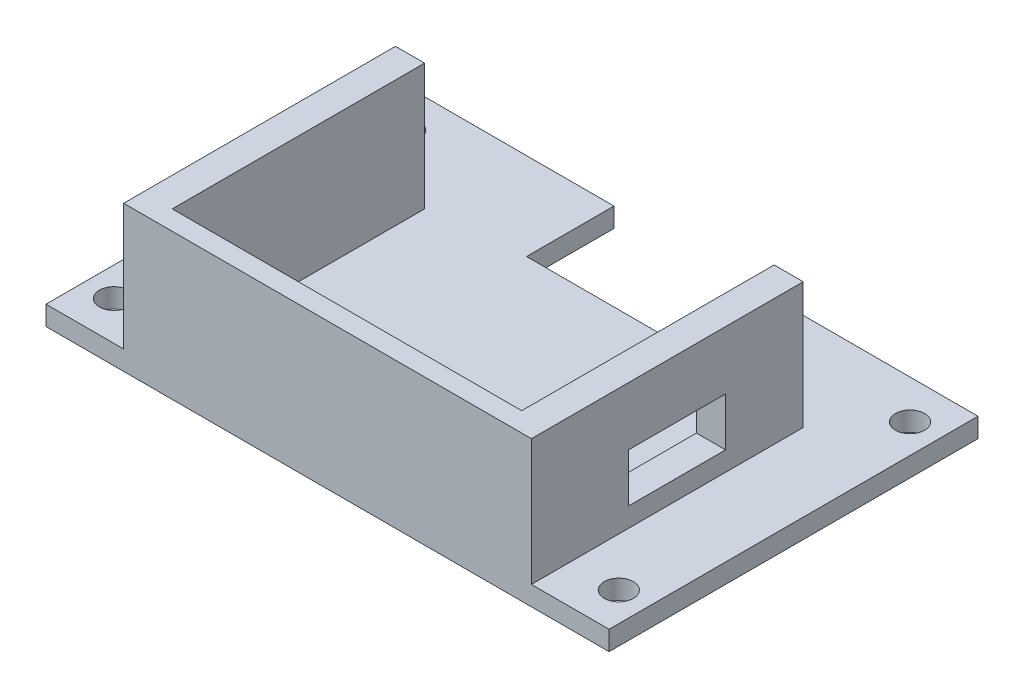
ISO-10303-21;
HEADER;
FILE_DESCRIPTION(('STEP AP214'),'2;1');
FILE_NAME('part.step','',(''),(''),'','','');
FILE_SCHEMA(('AUTOMOTIVE_DESIGN { 1 0 10303 214 1 1 1 1 }'));
ENDSEC;
DATA;
#1=APPLICATION_CONTEXT('core data for automotive mechanical design processes');
#2=APPLICATION_PROTOCOL_DEFINITION('international standard','automotive_design',2000,#1);
#3=PRODUCT_CONTEXT('',#1,'mechanical');
#4=PRODUCT('Part','Part','',(#3));
#5=PRODUCT_RELATED_PRODUCT_CATEGORY('part','',(#4));
#6=PRODUCT_DEFINITION_FORMATION('','',#4);
#7=PRODUCT_DEFINITION_CONTEXT('part definition',#1,'design');
#8=PRODUCT_DEFINITION('design','',#6,#7);
#9=PRODUCT_DEFINITION_SHAPE('','',#8);
#10=(LENGTH_UNIT() NAMED_UNIT(*) SI_UNIT(.MILLI.,.METRE.));
#11=(NAMED_UNIT(*) PLANE_ANGLE_UNIT() SI_UNIT($,.RADIAN.));
#12=(NAMED_UNIT(*) SI_UNIT($,.STERADIAN.) SOLID_ANGLE_UNIT());
#13=UNCERTAINTY_MEASURE_WITH_UNIT(LENGTH_MEASURE(1.E-05),#10,'distance_accuracy_value','');
#14=(GEOMETRIC_REPRESENTATION_CONTEXT(3) GLOBAL_UNCERTAINTY_ASSIGNED_CONTEXT((#13)) GLOBAL_UNIT_ASSIGNED_CONTEXT((#10,
#11,#12)) REPRESENTATION_CONTEXT('',''));
#15=CARTESIAN_POINT('',(0.,0.,0.));
#16=DIRECTION('',(0.,0.,1.));
#17=DIRECTION('',(1.,0.,0.));
#18=AXIS2_PLACEMENT_3D('',#15,#16,#17);
#19=CARTESIAN_POINT('',(0.,1.,0.));
#20=DIRECTION('',(0.,-1.,0.));
#21=DIRECTION('',(0.,0.,-1.));
#22=AXIS2_PLACEMENT_3D('',#19,#20,#21);
#23=PLANE('',#22);
#24=CARTESIAN_POINT('',(26.,1.,-15.));
#25=DIRECTION('',(0.,1.,0.));
#26=DIRECTION('',(0.,0.,-1.));
#27=AXIS2_PLACEMENT_3D('',#24,#25,#26);
#28=CIRCLE('',#27,1.5);
#29=CARTESIAN_POINT('',(26.,1.,-16.5));
#30=VERTEX_POINT('',#29);
#31=EDGE_CURVE('E696',#30,#30,#28,.T.);
#32=ORIENTED_EDGE('',*,*,#31,.F.);
#33=EDGE_LOOP('',(#32));
#34=FACE_BOUND('',#33,.T.);
#35=CARTESIAN_POINT('',(26.,1.,15.));
#36=DIRECTION('',(0.,1.,0.));
#37=DIRECTION('',(0.,0.,1.));
#38=AXIS2_PLACEMENT_3D('',#35,#36,#37);
#39=CIRCLE('',#38,1.5);
#40=CARTESIAN_POINT('',(26.,1.,16.5));
#41=VERTEX_POINT('',#40);
#42=EDGE_CURVE('E703',#41,#41,#39,.T.);
#43=ORIENTED_EDGE('',*,*,#42,.F.);
#44=EDGE_LOOP('',(#43));
#45=FACE_BOUND('',#44,.T.);
#46=CARTESIAN_POINT('',(-26.,1.,15.));
#47=DIRECTION('',(0.,1.,0.));
#48=DIRECTION('',(0.,0.,-1.));
#49=AXIS2_PLACEMENT_3D('',#46,#47,#48);
#50=CIRCLE('',#49,1.5);
#51=CARTESIAN_POINT('',(-26.,1.,13.5));
#52=VERTEX_POINT('',#51);
#53=EDGE_CURVE('E715',#52,#52,#50,.T.);
#54=ORIENTED_EDGE('',*,*,#53,.F.);
#55=EDGE_LOOP('',(#54));
#56=FACE_BOUND('',#55,.T.);
#57=CARTESIAN_POINT('',(-26.,1.,-15.));
#58=DIRECTION('',(0.,1.,0.));
#59=DIRECTION('',(0.,0.,1.));
#60=AXIS2_PLACEMENT_3D('',#57,#58,#59);
#61=CIRCLE('',#60,1.5);
#62=CARTESIAN_POINT('',(-26.,1.,-13.5));
#63=VERTEX_POINT('',#62);
#64=EDGE_CURVE('E708',#63,#63,#61,.T.);
#65=ORIENTED_EDGE('',*,*,#64,.F.);
#66=EDGE_LOOP('',(#65));
#67=FACE_BOUND('',#66,.T.);
#68=DIRECTION('',(1.,0.,0.));
#69=VECTOR('',#68,1.);
#70=CARTESIAN_POINT('',(-29.,1.,19.));
#71=LINE('',#70,#69);
#72=CARTESIAN_POINT('',(-29.,1.,19.));
#73=VERTEX_POINT('',#72);
#74=CARTESIAN_POINT('',(-21.,1.,19.));
#75=VERTEX_POINT('',#74);
#76=EDGE_CURVE('E354',#73,#75,#71,.T.);
#77=ORIENTED_EDGE('',*,*,#76,.T.);
#78=DIRECTION('',(0.,0.,1.));
#79=VECTOR('',#78,1.);
#80=CARTESIAN_POINT('',(-21.,1.,-8.99999999999999));
#81=LINE('',#80,#79);
#82=CARTESIAN_POINT('',(-21.,1.,-8.99999999999999));
#83=VERTEX_POINT('',#82);
#84=EDGE_CURVE('E255',#83,#75,#81,.T.);
#85=ORIENTED_EDGE('',*,*,#84,.F.);
#86=DIRECTION('',(-1.,0.,0.));
#87=VECTOR('',#86,1.);
#88=CARTESIAN_POINT('',(-18.,1.,-8.99999999999998));
#89=LINE('',#88,#87);
#90=CARTESIAN_POINT('',(-18.,1.,-8.99999999999998));
#91=VERTEX_POINT('',#90);
#92=EDGE_CURVE('E264',#91,#83,#89,.T.);
#93=ORIENTED_EDGE('',*,*,#92,.F.);
#94=DIRECTION('',(0.,0.,-1.));
#95=VECTOR('',#94,1.);
#96=CARTESIAN_POINT('',(-18.,1.,-8.99999999999998));
#97=LINE('',#96,#95);
#98=CARTESIAN_POINT('',(-18.,1.,17.));
#99=VERTEX_POINT('',#98);
#100=EDGE_CURVE('E250',#99,#91,#97,.T.);
#101=ORIENTED_EDGE('',*,*,#100,.F.);
#102=DIRECTION('',(-1.,0.,0.));
#103=VECTOR('',#102,1.);
#104=CARTESIAN_POINT('',(-21.,1.,17.));
#105=LINE('',#104,#103);
#106=CARTESIAN_POINT('',(18.,1.,17.));
#107=VERTEX_POINT('',#106);
#108=EDGE_CURVE('E225',#107,#99,#105,.T.);
#109=ORIENTED_EDGE('',*,*,#108,.F.);
#110=DIRECTION('',(0.,0.,1.));
#111=VECTOR('',#110,1.);
#112=CARTESIAN_POINT('',(18.,1.,-8.99999999999999));
#113=LINE('',#112,#111);
#114=CARTESIAN_POINT('',(18.,1.,-8.99999999999999));
#115=VERTEX_POINT('',#114);
#116=EDGE_CURVE('E277',#115,#107,#113,.T.);
#117=ORIENTED_EDGE('',*,*,#116,.F.);
#118=DIRECTION('',(-1.,0.,0.));
#119=VECTOR('',#118,1.);
#120=CARTESIAN_POINT('',(18.,1.,-8.99999999999999));
#121=LINE('',#120,#119);
#122=CARTESIAN_POINT('',(21.,1.,-8.99999999999999));
#123=VERTEX_POINT('',#122);
#124=EDGE_CURVE('E283',#123,#115,#121,.T.);
#125=ORIENTED_EDGE('',*,*,#124,.F.);
#126=DIRECTION('',(0.,0.,-1.));
#127=VECTOR('',#126,1.);
#128=CARTESIAN_POINT('',(21.,1.,-8.99999999999999));
#129=LINE('',#128,#127);
#130=CARTESIAN_POINT('',(21.,1.,19.));
#131=VERTEX_POINT('',#130);
#132=EDGE_CURVE('E293',#131,#123,#129,.T.);
#133=ORIENTED_EDGE('',*,*,#132,.F.);
#134=CARTESIAN_POINT('',(29.,1.,19.));
#135=VERTEX_POINT('',#134);
#136=EDGE_CURVE('E353',#131,#135,#71,.T.);
#137=ORIENTED_EDGE('',*,*,#136,.T.);
#138=DIRECTION('',(0.,0.,-1.));
#139=VECTOR('',#138,1.);
#140=CARTESIAN_POINT('',(29.,1.,19.));
#141=LINE('',#140,#139);
#142=CARTESIAN_POINT('',(29.,1.,-19.));
#143=VERTEX_POINT('',#142);
#144=EDGE_CURVE('E340',#135,#143,#141,.T.);
#145=ORIENTED_EDGE('',*,*,#144,.T.);
#146=DIRECTION('',(-1.,0.,0.));
#147=VECTOR('',#146,1.);
#148=CARTESIAN_POINT('',(-29.,1.,-19.));
#149=LINE('',#148,#147);
#150=CARTESIAN_POINT('',(8.5,1.,-19.));
#151=VERTEX_POINT('',#150);
#152=EDGE_CURVE('E346',#143,#151,#149,.T.);
#153=ORIENTED_EDGE('',*,*,#152,.T.);
#154=DIRECTION('',(0.,0.,-1.));
#155=VECTOR('',#154,1.);
#156=CARTESIAN_POINT('',(8.5,1.,-9.99999999999999));
#157=LINE('',#156,#155);
#158=CARTESIAN_POINT('',(8.5,1.,-9.99999999999999));
#159=VERTEX_POINT('',#158);
#160=EDGE_CURVE('E306',#159,#151,#157,.T.);
#161=ORIENTED_EDGE('',*,*,#160,.F.);
#162=DIRECTION('',(1.,0.,0.));
#163=VECTOR('',#162,1.);
#164=CARTESIAN_POINT('',(-8.5,1.,-9.99999999999999));
#165=LINE('',#164,#163);
#166=CARTESIAN_POINT('',(-8.5,1.,-9.99999999999999));
#167=VERTEX_POINT('',#166);
#168=EDGE_CURVE('E312',#167,#159,#165,.T.);
#169=ORIENTED_EDGE('',*,*,#168,.F.);
#170=DIRECTION('',(0.,0.,1.));
#171=VECTOR('',#170,1.);
#172=CARTESIAN_POINT('',(-8.5,1.,-9.99999999999999));
#173=LINE('',#172,#171);
#174=CARTESIAN_POINT('',(-8.5,1.,-19.));
#175=VERTEX_POINT('',#174);
#176=EDGE_CURVE('E309',#175,#167,#173,.T.);
#177=ORIENTED_EDGE('',*,*,#176,.F.);
#178=CARTESIAN_POINT('',(-29.,1.,-19.));
#179=VERTEX_POINT('',#178);
#180=EDGE_CURVE('E344',#175,#179,#149,.T.);
#181=ORIENTED_EDGE('',*,*,#180,.T.);
#182=DIRECTION('',(0.,0.,1.));
#183=VECTOR('',#182,1.);
#184=CARTESIAN_POINT('',(-29.,1.,19.));
#185=LINE('',#184,#183);
#186=EDGE_CURVE('E350',#179,#73,#185,.T.);
#187=ORIENTED_EDGE('',*,*,#186,.T.);
#188=EDGE_LOOP('',(#77,#85,#93,#101,#109,#117,#125,#133,#137,#145,#153,#161,#169,#177,#181,#187));
#189=FACE_BOUND('',#188,.T.);
#190=ADVANCED_FACE('F41',(#34,#45,#56,#67,#189),#23,.F.);
#191=CARTESIAN_POINT('',(18.,14.,-8.99999999999999));
#192=DIRECTION('',(1.,0.,0.));
#193=DIRECTION('',(0.,0.,-1.));
#194=AXIS2_PLACEMENT_3D('',#191,#192,#193);
#195=PLANE('',#194);
#196=DIRECTION('',(0.,1.,0.));
#197=VECTOR('',#196,1.);
#198=CARTESIAN_POINT('',(18.,14.,9.00000000000001));
#199=LINE('',#198,#197);
#200=CARTESIAN_POINT('',(18.,3.,9.00000000000001));
#201=VERTEX_POINT('',#200);
#202=CARTESIAN_POINT('',(18.,8.,9.00000000000001));
#203=VERTEX_POINT('',#202);
#204=EDGE_CURVE('E193',#201,#203,#199,.T.);
#205=ORIENTED_EDGE('',*,*,#204,.F.);
#206=DIRECTION('',(0.,0.,1.));
#207=VECTOR('',#206,1.);
#208=CARTESIAN_POINT('',(18.,3.,-8.99999999999998));
#209=LINE('',#208,#207);
#210=CARTESIAN_POINT('',(18.,3.,-0.999999999999994));
#211=VERTEX_POINT('',#210);
#212=EDGE_CURVE('E57',#211,#201,#209,.T.);
#213=ORIENTED_EDGE('',*,*,#212,.F.);
#214=DIRECTION('',(0.,-1.,0.));
#215=VECTOR('',#214,1.);
#216=CARTESIAN_POINT('',(18.,14.,-0.999999999999994));
#217=LINE('',#216,#215);
#218=CARTESIAN_POINT('',(18.,8.,-0.999999999999994));
#219=VERTEX_POINT('',#218);
#220=EDGE_CURVE('E206',#219,#211,#217,.T.);
#221=ORIENTED_EDGE('',*,*,#220,.F.);
#222=DIRECTION('',(0.,0.,-1.));
#223=VECTOR('',#222,1.);
#224=CARTESIAN_POINT('',(18.,8.,-8.99999999999998));
#225=LINE('',#224,#223);
#226=EDGE_CURVE('E201',#203,#219,#225,.T.);
#227=ORIENTED_EDGE('',*,*,#226,.F.);
#228=EDGE_LOOP('',(#205,#213,#221,#227));
#229=FACE_BOUND('',#228,.T.);
#230=DIRECTION('',(0.,-1.,0.));
#231=VECTOR('',#230,1.);
#232=CARTESIAN_POINT('',(18.,14.,17.));
#233=LINE('',#232,#231);
#234=CARTESIAN_POINT('',(18.,14.,17.));
#235=VERTEX_POINT('',#234);
#236=EDGE_CURVE('E247',#235,#107,#233,.T.);
#237=ORIENTED_EDGE('',*,*,#236,.F.);
#238=DIRECTION('',(0.,0.,1.));
#239=VECTOR('',#238,1.);
#240=CARTESIAN_POINT('',(18.,14.,-8.99999999999999));
#241=LINE('',#240,#239);
#242=CARTESIAN_POINT('',(18.,14.,-8.99999999999999));
#243=VERTEX_POINT('',#242);
#244=EDGE_CURVE('E278',#243,#235,#241,.T.);
#245=ORIENTED_EDGE('',*,*,#244,.F.);
#246=DIRECTION('',(0.,-1.,0.));
#247=VECTOR('',#246,1.);
#248=CARTESIAN_POINT('',(18.,14.,-8.99999999999999));
#249=LINE('',#248,#247);
#250=EDGE_CURVE('E289',#243,#115,#249,.T.);
#251=ORIENTED_EDGE('',*,*,#250,.T.);
#252=ORIENTED_EDGE('',*,*,#116,.T.);
#253=EDGE_LOOP('',(#237,#245,#251,#252));
#254=FACE_BOUND('',#253,.T.);
#255=ADVANCED_FACE('F430',(#229,#254),#195,.F.);
#256=CARTESIAN_POINT('',(-18.,14.,-8.99999999999998));
#257=DIRECTION('',(-1.,0.,0.));
#258=DIRECTION('',(0.,0.,1.));
#259=AXIS2_PLACEMENT_3D('',#256,#257,#258);
#260=PLANE('',#259);
#261=DIRECTION('',(0.,1.,0.));
#262=VECTOR('',#261,1.);
#263=CARTESIAN_POINT('',(-18.,14.,17.));
#264=LINE('',#263,#262);
#265=CARTESIAN_POINT('',(-18.,14.,17.));
#266=VERTEX_POINT('',#265);
#267=EDGE_CURVE('E244',#99,#266,#264,.T.);
#268=ORIENTED_EDGE('',*,*,#267,.F.);
#269=ORIENTED_EDGE('',*,*,#100,.T.);
#270=DIRECTION('',(0.,-1.,0.));
#271=VECTOR('',#270,1.);
#272=CARTESIAN_POINT('',(-18.,14.,-8.99999999999998));
#273=LINE('',#272,#271);
#274=CARTESIAN_POINT('',(-18.,14.,-8.99999999999998));
#275=VERTEX_POINT('',#274);
#276=EDGE_CURVE('E273',#275,#91,#273,.T.);
#277=ORIENTED_EDGE('',*,*,#276,.F.);
#278=DIRECTION('',(0.,0.,-1.));
#279=VECTOR('',#278,1.);
#280=CARTESIAN_POINT('',(-18.,14.,-8.99999999999998));
#281=LINE('',#280,#279);
#282=EDGE_CURVE('E251',#266,#275,#281,.T.);
#283=ORIENTED_EDGE('',*,*,#282,.F.);
#284=EDGE_LOOP('',(#268,#269,#277,#283));
#285=FACE_BOUND('',#284,.T.);
#286=ADVANCED_FACE('F428',(#285),#260,.F.);
#287=CARTESIAN_POINT('',(-29.,1.,-19.));
#288=DIRECTION('',(0.,0.,1.));
#289=DIRECTION('',(1.,0.,0.));
#290=AXIS2_PLACEMENT_3D('',#287,#288,#289);
#291=PLANE('',#290);
#292=DIRECTION('',(-1.,0.,0.));
#293=VECTOR('',#292,1.);
#294=CARTESIAN_POINT('',(-29.,-1.,-19.));
#295=LINE('',#294,#293);
#296=CARTESIAN_POINT('',(29.,-1.,-19.));
#297=VERTEX_POINT('',#296);
#298=CARTESIAN_POINT('',(8.5,-1.,-19.));
#299=VERTEX_POINT('',#298);
#300=EDGE_CURVE('E363',#297,#299,#295,.T.);
#301=ORIENTED_EDGE('',*,*,#300,.T.);
#302=DIRECTION('',(0.,1.,0.));
#303=VECTOR('',#302,1.);
#304=CARTESIAN_POINT('',(8.5,1.,-19.));
#305=LINE('',#304,#303);
#306=EDGE_CURVE('E335',#299,#151,#305,.T.);
#307=ORIENTED_EDGE('',*,*,#306,.T.);
#308=ORIENTED_EDGE('',*,*,#152,.F.);
#309=DIRECTION('',(0.,-1.,0.));
#310=VECTOR('',#309,1.);
#311=CARTESIAN_POINT('',(29.,1.,-19.));
#312=LINE('',#311,#310);
#313=EDGE_CURVE('E50',#143,#297,#312,.T.);
#314=ORIENTED_EDGE('',*,*,#313,.T.);
#315=EDGE_LOOP('',(#301,#307,#308,#314));
#316=FACE_BOUND('',#315,.T.);
#317=ADVANCED_FACE('F386',(#316),#291,.F.);
#318=CARTESIAN_POINT('',(29.,1.,19.));
#319=DIRECTION('',(-1.,0.,0.));
#320=DIRECTION('',(0.,0.,1.));
#321=AXIS2_PLACEMENT_3D('',#318,#319,#320);
#322=PLANE('',#321);
#323=DIRECTION('',(0.,0.,-1.));
#324=VECTOR('',#323,1.);
#325=CARTESIAN_POINT('',(29.,-1.,19.));
#326=LINE('',#325,#324);
#327=CARTESIAN_POINT('',(29.,-1.,19.));
#328=VERTEX_POINT('',#327);
#329=EDGE_CURVE('E339',#328,#297,#326,.T.);
#330=ORIENTED_EDGE('',*,*,#329,.T.);
#331=ORIENTED_EDGE('',*,*,#313,.F.);
#332=ORIENTED_EDGE('',*,*,#144,.F.);
#333=DIRECTION('',(0.,-1.,0.));
#334=VECTOR('',#333,1.);
#335=CARTESIAN_POINT('',(29.,1.,19.));
#336=LINE('',#335,#334);
#337=EDGE_CURVE('E358',#135,#328,#336,.T.);
#338=ORIENTED_EDGE('',*,*,#337,.T.);
#339=EDGE_LOOP('',(#330,#331,#332,#338));
#340=FACE_BOUND('',#339,.T.);
#341=ADVANCED_FACE('F43',(#340),#322,.F.);
#342=ORIENTED_EDGE('',*,*,#180,.F.);
#343=DIRECTION('',(0.,-1.,0.));
#344=VECTOR('',#343,1.);
#345=CARTESIAN_POINT('',(-8.5,1.,-19.));
#346=LINE('',#345,#344);
#347=CARTESIAN_POINT('',(-8.5,-1.,-19.));
#348=VERTEX_POINT('',#347);
#349=EDGE_CURVE('E328',#175,#348,#346,.T.);
#350=ORIENTED_EDGE('',*,*,#349,.T.);
#351=CARTESIAN_POINT('',(-29.,-1.,-19.));
#352=VERTEX_POINT('',#351);
#353=EDGE_CURVE('E362',#348,#352,#295,.T.);
#354=ORIENTED_EDGE('',*,*,#353,.T.);
#355=DIRECTION('',(0.,-1.,0.));
#356=VECTOR('',#355,1.);
#357=CARTESIAN_POINT('',(-29.,1.,-19.));
#358=LINE('',#357,#356);
#359=EDGE_CURVE('E379',#179,#352,#358,.T.);
#360=ORIENTED_EDGE('',*,*,#359,.F.);
#361=EDGE_LOOP('',(#342,#350,#354,#360));
#362=FACE_BOUND('',#361,.T.);
#363=ADVANCED_FACE('F420',(#362),#291,.F.);
#364=CARTESIAN_POINT('',(-29.,1.,19.));
#365=DIRECTION('',(1.,0.,0.));
#366=DIRECTION('',(0.,0.,-1.));
#367=AXIS2_PLACEMENT_3D('',#364,#365,#366);
#368=PLANE('',#367);
#369=DIRECTION('',(0.,0.,1.));
#370=VECTOR('',#369,1.);
#371=CARTESIAN_POINT('',(-29.,-1.,19.));
#372=LINE('',#371,#370);
#373=CARTESIAN_POINT('',(-29.,-1.,19.));
#374=VERTEX_POINT('',#373);
#375=EDGE_CURVE('E367',#352,#374,#372,.T.);
#376=ORIENTED_EDGE('',*,*,#375,.T.);
#377=DIRECTION('',(0.,-1.,0.));
#378=VECTOR('',#377,1.);
#379=CARTESIAN_POINT('',(-29.,1.,19.));
#380=LINE('',#379,#378);
#381=EDGE_CURVE('E375',#73,#374,#380,.T.);
#382=ORIENTED_EDGE('',*,*,#381,.F.);
#383=ORIENTED_EDGE('',*,*,#186,.F.);
#384=ORIENTED_EDGE('',*,*,#359,.T.);
#385=EDGE_LOOP('',(#376,#382,#383,#384));
#386=FACE_BOUND('',#385,.T.);
#387=ADVANCED_FACE('F412',(#386),#368,.F.);
#388=CARTESIAN_POINT('',(-29.,1.,19.));
#389=DIRECTION('',(0.,0.,-1.));
#390=DIRECTION('',(-1.,0.,0.));
#391=AXIS2_PLACEMENT_3D('',#388,#389,#390);
#392=PLANE('',#391);
#393=DIRECTION('',(1.,0.,0.));
#394=VECTOR('',#393,1.);
#395=CARTESIAN_POINT('',(-29.,-1.,19.));
#396=LINE('',#395,#394);
#397=EDGE_CURVE('E345',#374,#328,#396,.T.);
#398=ORIENTED_EDGE('',*,*,#397,.T.);
#399=ORIENTED_EDGE('',*,*,#337,.F.);
#400=ORIENTED_EDGE('',*,*,#136,.F.);
#401=DIRECTION('',(0.,-1.,0.));
#402=VECTOR('',#401,1.);
#403=CARTESIAN_POINT('',(21.,14.,19.));
#404=LINE('',#403,#402);
#405=CARTESIAN_POINT('',(21.,14.,19.));
#406=VERTEX_POINT('',#405);
#407=EDGE_CURVE('E234',#406,#131,#404,.T.);
#408=ORIENTED_EDGE('',*,*,#407,.F.);
#409=DIRECTION('',(1.,0.,0.));
#410=VECTOR('',#409,1.);
#411=CARTESIAN_POINT('',(-21.,14.,19.));
#412=LINE('',#411,#410);
#413=CARTESIAN_POINT('',(-21.,14.,19.));
#414=VERTEX_POINT('',#413);
#415=EDGE_CURVE('E226',#414,#406,#412,.T.);
#416=ORIENTED_EDGE('',*,*,#415,.F.);
#417=DIRECTION('',(0.,-1.,0.));
#418=VECTOR('',#417,1.);
#419=CARTESIAN_POINT('',(-21.,14.,19.));
#420=LINE('',#419,#418);
#421=EDGE_CURVE('E240',#414,#75,#420,.T.);
#422=ORIENTED_EDGE('',*,*,#421,.T.);
#423=ORIENTED_EDGE('',*,*,#76,.F.);
#424=ORIENTED_EDGE('',*,*,#381,.T.);
#425=EDGE_LOOP('',(#398,#399,#400,#408,#416,#422,#423,#424));
#426=FACE_BOUND('',#425,.T.);
#427=ADVANCED_FACE('F407',(#426),#392,.F.);
#428=CARTESIAN_POINT('',(0.,-1.,0.));
#429=DIRECTION('',(0.,-1.,0.));
#430=DIRECTION('',(0.,0.,-1.));
#431=AXIS2_PLACEMENT_3D('',#428,#429,#430);
#432=PLANE('',#431);
#433=CARTESIAN_POINT('',(26.,-1.,-15.));
#434=DIRECTION('',(0.,-1.,0.));
#435=DIRECTION('',(0.,0.,-1.));
#436=AXIS2_PLACEMENT_3D('',#433,#434,#435);
#437=CIRCLE('',#436,1.5);
#438=CARTESIAN_POINT('',(26.,-1.,-16.5));
#439=VERTEX_POINT('',#438);
#440=EDGE_CURVE('E694',#439,#439,#437,.F.);
#441=ORIENTED_EDGE('',*,*,#440,.T.);
#442=EDGE_LOOP('',(#441));
#443=FACE_BOUND('',#442,.T.);
#444=CARTESIAN_POINT('',(26.,-1.,15.));
#445=DIRECTION('',(0.,-1.,0.));
#446=DIRECTION('',(0.,0.,-1.));
#447=AXIS2_PLACEMENT_3D('',#444,#445,#446);
#448=CIRCLE('',#447,1.5);
#449=CARTESIAN_POINT('',(26.,-1.,13.5));
#450=VERTEX_POINT('',#449);
#451=EDGE_CURVE('E698',#450,#450,#448,.F.);
#452=ORIENTED_EDGE('',*,*,#451,.T.);
#453=EDGE_LOOP('',(#452));
#454=FACE_BOUND('',#453,.T.);
#455=CARTESIAN_POINT('',(-26.,-1.,15.));
#456=DIRECTION('',(0.,-1.,0.));
#457=DIRECTION('',(0.,0.,-1.));
#458=AXIS2_PLACEMENT_3D('',#455,#456,#457);
#459=CIRCLE('',#458,1.5);
#460=CARTESIAN_POINT('',(-26.,-1.,13.5));
#461=VERTEX_POINT('',#460);
#462=EDGE_CURVE('E720',#461,#461,#459,.F.);
#463=ORIENTED_EDGE('',*,*,#462,.T.);
#464=EDGE_LOOP('',(#463));
#465=FACE_BOUND('',#464,.T.);
#466=CARTESIAN_POINT('',(-26.,-1.,-15.));
#467=DIRECTION('',(0.,-1.,0.));
#468=DIRECTION('',(0.,0.,-1.));
#469=AXIS2_PLACEMENT_3D('',#466,#467,#468);
#470=CIRCLE('',#469,1.5);
#471=CARTESIAN_POINT('',(-26.,-1.,-16.5));
#472=VERTEX_POINT('',#471);
#473=EDGE_CURVE('E712',#472,#472,#470,.F.);
#474=ORIENTED_EDGE('',*,*,#473,.T.);
#475=EDGE_LOOP('',(#474));
#476=FACE_BOUND('',#475,.T.);
#477=DIRECTION('',(0.,0.,-1.));
#478=VECTOR('',#477,1.);
#479=CARTESIAN_POINT('',(8.5,-1.,-9.99999999999999));
#480=LINE('',#479,#478);
#481=CARTESIAN_POINT('',(8.5,-1.,-9.99999999999999));
#482=VERTEX_POINT('',#481);
#483=EDGE_CURVE('E316',#482,#299,#480,.T.);
#484=ORIENTED_EDGE('',*,*,#483,.T.);
#485=ORIENTED_EDGE('',*,*,#300,.F.);
#486=ORIENTED_EDGE('',*,*,#329,.F.);
#487=ORIENTED_EDGE('',*,*,#397,.F.);
#488=ORIENTED_EDGE('',*,*,#375,.F.);
#489=ORIENTED_EDGE('',*,*,#353,.F.);
#490=DIRECTION('',(0.,0.,-1.));
#491=VECTOR('',#490,1.);
#492=CARTESIAN_POINT('',(-8.5,-1.,0.));
#493=LINE('',#492,#491);
#494=CARTESIAN_POINT('',(-8.5,-1.,-9.99999999999999));
#495=VERTEX_POINT('',#494);
#496=EDGE_CURVE('E11',#495,#348,#493,.T.);
#497=ORIENTED_EDGE('',*,*,#496,.F.);
#498=DIRECTION('',(1.,0.,0.));
#499=VECTOR('',#498,1.);
#500=CARTESIAN_POINT('',(-8.5,-1.,-9.99999999999999));
#501=LINE('',#500,#499);
#502=EDGE_CURVE('E320',#495,#482,#501,.T.);
#503=ORIENTED_EDGE('',*,*,#502,.T.);
#504=EDGE_LOOP('',(#484,#485,#486,#487,#488,#489,#497,#503));
#505=FACE_BOUND('',#504,.T.);
#506=ADVANCED_FACE('F393',(#443,#454,#465,#476,#505),#432,.T.);
#507=CARTESIAN_POINT('',(8.5,-1.,-9.99999999999999));
#508=DIRECTION('',(1.,0.,0.));
#509=DIRECTION('',(0.,0.,-1.));
#510=AXIS2_PLACEMENT_3D('',#507,#508,#509);
#511=PLANE('',#510);
#512=ORIENTED_EDGE('',*,*,#483,.F.);
#513=DIRECTION('',(0.,1.,0.));
#514=VECTOR('',#513,1.);
#515=CARTESIAN_POINT('',(8.5,-1.,-9.99999999999999));
#516=LINE('',#515,#514);
#517=EDGE_CURVE('E325',#482,#159,#516,.T.);
#518=ORIENTED_EDGE('',*,*,#517,.T.);
#519=ORIENTED_EDGE('',*,*,#160,.T.);
#520=ORIENTED_EDGE('',*,*,#306,.F.);
#521=EDGE_LOOP('',(#512,#518,#519,#520));
#522=FACE_BOUND('',#521,.T.);
#523=ADVANCED_FACE('F398',(#522),#511,.F.);
#524=CARTESIAN_POINT('',(-8.5,-1.,-9.99999999999999));
#525=DIRECTION('',(-1.,0.,0.));
#526=DIRECTION('',(0.,0.,1.));
#527=AXIS2_PLACEMENT_3D('',#524,#525,#526);
#528=PLANE('',#527);
#529=ORIENTED_EDGE('',*,*,#176,.T.);
#530=DIRECTION('',(0.,1.,0.));
#531=VECTOR('',#530,1.);
#532=CARTESIAN_POINT('',(-8.5,-1.,-9.99999999999999));
#533=LINE('',#532,#531);
#534=EDGE_CURVE('E324',#495,#167,#533,.T.);
#535=ORIENTED_EDGE('',*,*,#534,.F.);
#536=ORIENTED_EDGE('',*,*,#496,.T.);
#537=ORIENTED_EDGE('',*,*,#349,.F.);
#538=EDGE_LOOP('',(#529,#535,#536,#537));
#539=FACE_BOUND('',#538,.T.);
#540=ADVANCED_FACE('F464',(#539),#528,.F.);
#541=CARTESIAN_POINT('',(-8.5,-1.,-9.99999999999999));
#542=DIRECTION('',(0.,0.,1.));
#543=DIRECTION('',(1.,0.,0.));
#544=AXIS2_PLACEMENT_3D('',#541,#542,#543);
#545=PLANE('',#544);
#546=ORIENTED_EDGE('',*,*,#517,.F.);
#547=ORIENTED_EDGE('',*,*,#502,.F.);
#548=ORIENTED_EDGE('',*,*,#534,.T.);
#549=ORIENTED_EDGE('',*,*,#168,.T.);
#550=EDGE_LOOP('',(#546,#547,#548,#549));
#551=FACE_BOUND('',#550,.T.);
#552=ADVANCED_FACE('F470',(#551),#545,.F.);
#553=CARTESIAN_POINT('',(21.,14.,-8.99999999999999));
#554=DIRECTION('',(-1.,0.,0.));
#555=DIRECTION('',(0.,0.,1.));
#556=AXIS2_PLACEMENT_3D('',#553,#554,#555);
#557=PLANE('',#556);
#558=DIRECTION('',(0.,1.,0.));
#559=VECTOR('',#558,1.);
#560=CARTESIAN_POINT('',(21.,14.,-0.999999999999994));
#561=LINE('',#560,#559);
#562=CARTESIAN_POINT('',(21.,3.,-0.999999999999994));
#563=VERTEX_POINT('',#562);
#564=CARTESIAN_POINT('',(21.,8.,-0.999999999999994));
#565=VERTEX_POINT('',#564);
#566=EDGE_CURVE('E199',#563,#565,#561,.T.);
#567=ORIENTED_EDGE('',*,*,#566,.F.);
#568=DIRECTION('',(0.,0.,-1.));
#569=VECTOR('',#568,1.);
#570=CARTESIAN_POINT('',(21.,3.,-8.99999999999998));
#571=LINE('',#570,#569);
#572=CARTESIAN_POINT('',(21.,3.,9.00000000000001));
#573=VERTEX_POINT('',#572);
#574=EDGE_CURVE('E180',#573,#563,#571,.T.);
#575=ORIENTED_EDGE('',*,*,#574,.F.);
#576=DIRECTION('',(0.,-1.,0.));
#577=VECTOR('',#576,1.);
#578=CARTESIAN_POINT('',(21.,14.,9.00000000000001));
#579=LINE('',#578,#577);
#580=CARTESIAN_POINT('',(21.,8.,9.00000000000001));
#581=VERTEX_POINT('',#580);
#582=EDGE_CURVE('E189',#581,#573,#579,.T.);
#583=ORIENTED_EDGE('',*,*,#582,.F.);
#584=DIRECTION('',(0.,0.,1.));
#585=VECTOR('',#584,1.);
#586=CARTESIAN_POINT('',(21.,8.,-8.99999999999998));
#587=LINE('',#586,#585);
#588=EDGE_CURVE('E65',#565,#581,#587,.T.);
#589=ORIENTED_EDGE('',*,*,#588,.F.);
#590=EDGE_LOOP('',(#567,#575,#583,#589));
#591=FACE_BOUND('',#590,.T.);
#592=ORIENTED_EDGE('',*,*,#132,.T.);
#593=DIRECTION('',(0.,-1.,0.));
#594=VECTOR('',#593,1.);
#595=CARTESIAN_POINT('',(21.,14.,-8.99999999999999));
#596=LINE('',#595,#594);
#597=CARTESIAN_POINT('',(21.,14.,-8.99999999999999));
#598=VERTEX_POINT('',#597);
#599=EDGE_CURVE('E302',#598,#123,#596,.T.);
#600=ORIENTED_EDGE('',*,*,#599,.F.);
#601=DIRECTION('',(0.,0.,-1.));
#602=VECTOR('',#601,1.);
#603=CARTESIAN_POINT('',(21.,14.,-8.99999999999999));
#604=LINE('',#603,#602);
#605=EDGE_CURVE('E282',#406,#598,#604,.T.);
#606=ORIENTED_EDGE('',*,*,#605,.F.);
#607=ORIENTED_EDGE('',*,*,#407,.T.);
#608=EDGE_LOOP('',(#592,#600,#606,#607));
#609=FACE_BOUND('',#608,.T.);
#610=ADVANCED_FACE('F196',(#591,#609),#557,.F.);
#611=CARTESIAN_POINT('',(18.,14.,-8.99999999999999));
#612=DIRECTION('',(0.,0.,1.));
#613=DIRECTION('',(1.,0.,0.));
#614=AXIS2_PLACEMENT_3D('',#611,#612,#613);
#615=PLANE('',#614);
#616=ORIENTED_EDGE('',*,*,#124,.T.);
#617=ORIENTED_EDGE('',*,*,#250,.F.);
#618=DIRECTION('',(-1.,0.,0.));
#619=VECTOR('',#618,1.);
#620=CARTESIAN_POINT('',(18.,14.,-8.99999999999999));
#621=LINE('',#620,#619);
#622=EDGE_CURVE('E286',#598,#243,#621,.T.);
#623=ORIENTED_EDGE('',*,*,#622,.F.);
#624=ORIENTED_EDGE('',*,*,#599,.T.);
#625=EDGE_LOOP('',(#616,#617,#623,#624));
#626=FACE_BOUND('',#625,.T.);
#627=ADVANCED_FACE('F485',(#626),#615,.F.);
#628=CARTESIAN_POINT('',(0.,14.,0.));
#629=DIRECTION('',(0.,1.,0.));
#630=DIRECTION('',(0.,0.,1.));
#631=AXIS2_PLACEMENT_3D('',#628,#629,#630);
#632=PLANE('',#631);
#633=ORIENTED_EDGE('',*,*,#605,.T.);
#634=ORIENTED_EDGE('',*,*,#622,.T.);
#635=ORIENTED_EDGE('',*,*,#244,.T.);
#636=DIRECTION('',(-1.,0.,0.));
#637=VECTOR('',#636,1.);
#638=CARTESIAN_POINT('',(-21.,14.,17.));
#639=LINE('',#638,#637);
#640=EDGE_CURVE('E230',#235,#266,#639,.T.);
#641=ORIENTED_EDGE('',*,*,#640,.T.);
#642=ORIENTED_EDGE('',*,*,#282,.T.);
#643=DIRECTION('',(-1.,0.,0.));
#644=VECTOR('',#643,1.);
#645=CARTESIAN_POINT('',(-18.,14.,-8.99999999999998));
#646=LINE('',#645,#644);
#647=CARTESIAN_POINT('',(-21.,14.,-8.99999999999999));
#648=VERTEX_POINT('',#647);
#649=EDGE_CURVE('E254',#275,#648,#646,.T.);
#650=ORIENTED_EDGE('',*,*,#649,.T.);
#651=DIRECTION('',(0.,0.,1.));
#652=VECTOR('',#651,1.);
#653=CARTESIAN_POINT('',(-21.,14.,-8.99999999999999));
#654=LINE('',#653,#652);
#655=EDGE_CURVE('E258',#648,#414,#654,.T.);
#656=ORIENTED_EDGE('',*,*,#655,.T.);
#657=ORIENTED_EDGE('',*,*,#415,.T.);
#658=EDGE_LOOP('',(#633,#634,#635,#641,#642,#650,#656,#657));
#659=FACE_BOUND('',#658,.T.);
#660=ADVANCED_FACE('F493',(#659),#632,.T.);
#661=CARTESIAN_POINT('',(-18.,14.,-8.99999999999998));
#662=DIRECTION('',(0.,0.,1.));
#663=DIRECTION('',(1.,0.,0.));
#664=AXIS2_PLACEMENT_3D('',#661,#662,#663);
#665=PLANE('',#664);
#666=ORIENTED_EDGE('',*,*,#92,.T.);
#667=DIRECTION('',(0.,-1.,0.));
#668=VECTOR('',#667,1.);
#669=CARTESIAN_POINT('',(-21.,14.,-8.99999999999999));
#670=LINE('',#669,#668);
#671=EDGE_CURVE('E261',#648,#83,#670,.T.);
#672=ORIENTED_EDGE('',*,*,#671,.F.);
#673=ORIENTED_EDGE('',*,*,#649,.F.);
#674=ORIENTED_EDGE('',*,*,#276,.T.);
#675=EDGE_LOOP('',(#666,#672,#673,#674));
#676=FACE_BOUND('',#675,.T.);
#677=ADVANCED_FACE('F501',(#676),#665,.F.);
#678=CARTESIAN_POINT('',(-21.,14.,-8.99999999999999));
#679=DIRECTION('',(1.,0.,0.));
#680=DIRECTION('',(0.,0.,-1.));
#681=AXIS2_PLACEMENT_3D('',#678,#679,#680);
#682=PLANE('',#681);
#683=ORIENTED_EDGE('',*,*,#421,.F.);
#684=ORIENTED_EDGE('',*,*,#655,.F.);
#685=ORIENTED_EDGE('',*,*,#671,.T.);
#686=ORIENTED_EDGE('',*,*,#84,.T.);
#687=EDGE_LOOP('',(#683,#684,#685,#686));
#688=FACE_BOUND('',#687,.T.);
#689=ADVANCED_FACE('F509',(#688),#682,.F.);
#690=CARTESIAN_POINT('',(-21.,14.,17.));
#691=DIRECTION('',(0.,0.,1.));
#692=DIRECTION('',(1.,0.,0.));
#693=AXIS2_PLACEMENT_3D('',#690,#691,#692);
#694=PLANE('',#693);
#695=ORIENTED_EDGE('',*,*,#640,.F.);
#696=ORIENTED_EDGE('',*,*,#236,.T.);
#697=ORIENTED_EDGE('',*,*,#108,.T.);
#698=ORIENTED_EDGE('',*,*,#267,.T.);
#699=EDGE_LOOP('',(#695,#696,#697,#698));
#700=FACE_BOUND('',#699,.T.);
#701=ADVANCED_FACE('F516',(#700),#694,.F.);
#702=CARTESIAN_POINT('',(29.001,3.,-8.99999999999998));
#703=DIRECTION('',(0.,-1.,0.));
#704=DIRECTION('',(0.,0.,-1.));
#705=AXIS2_PLACEMENT_3D('',#702,#703,#704);
#706=PLANE('',#705);
#707=ORIENTED_EDGE('',*,*,#212,.T.);
#708=DIRECTION('',(-1.,0.,0.));
#709=VECTOR('',#708,1.);
#710=CARTESIAN_POINT('',(29.001,3.,9.00000000000001));
#711=LINE('',#710,#709);
#712=EDGE_CURVE('E176',#573,#201,#711,.T.);
#713=ORIENTED_EDGE('',*,*,#712,.F.);
#714=ORIENTED_EDGE('',*,*,#574,.T.);
#715=DIRECTION('',(-1.,0.,0.));
#716=VECTOR('',#715,1.);
#717=CARTESIAN_POINT('',(29.001,3.,-0.999999999999994));
#718=LINE('',#717,#716);
#719=EDGE_CURVE('E194',#563,#211,#718,.T.);
#720=ORIENTED_EDGE('',*,*,#719,.T.);
#721=EDGE_LOOP('',(#707,#713,#714,#720));
#722=FACE_BOUND('',#721,.T.);
#723=ADVANCED_FACE('F178',(#722),#706,.F.);
#724=CARTESIAN_POINT('',(29.001,14.,-0.999999999999994));
#725=DIRECTION('',(0.,0.,-1.));
#726=DIRECTION('',(-1.,0.,0.));
#727=AXIS2_PLACEMENT_3D('',#724,#725,#726);
#728=PLANE('',#727);
#729=ORIENTED_EDGE('',*,*,#220,.T.);
#730=ORIENTED_EDGE('',*,*,#719,.F.);
#731=ORIENTED_EDGE('',*,*,#566,.T.);
#732=DIRECTION('',(-1.,0.,0.));
#733=VECTOR('',#732,1.);
#734=CARTESIAN_POINT('',(29.001,8.,-0.999999999999994));
#735=LINE('',#734,#733);
#736=EDGE_CURVE('E218',#565,#219,#735,.T.);
#737=ORIENTED_EDGE('',*,*,#736,.T.);
#738=EDGE_LOOP('',(#729,#730,#731,#737));
#739=FACE_BOUND('',#738,.T.);
#740=ADVANCED_FACE('F530',(#739),#728,.F.);
#741=CARTESIAN_POINT('',(29.001,8.,-8.99999999999998));
#742=DIRECTION('',(0.,1.,0.));
#743=DIRECTION('',(0.,0.,1.));
#744=AXIS2_PLACEMENT_3D('',#741,#742,#743);
#745=PLANE('',#744);
#746=ORIENTED_EDGE('',*,*,#226,.T.);
#747=ORIENTED_EDGE('',*,*,#736,.F.);
#748=ORIENTED_EDGE('',*,*,#588,.T.);
#749=DIRECTION('',(-1.,0.,0.));
#750=VECTOR('',#749,1.);
#751=CARTESIAN_POINT('',(29.001,8.,9.00000000000001));
#752=LINE('',#751,#750);
#753=EDGE_CURVE('E186',#581,#203,#752,.T.);
#754=ORIENTED_EDGE('',*,*,#753,.T.);
#755=EDGE_LOOP('',(#746,#747,#748,#754));
#756=FACE_BOUND('',#755,.T.);
#757=ADVANCED_FACE('F537',(#756),#745,.F.);
#758=CARTESIAN_POINT('',(29.001,14.,9.00000000000001));
#759=DIRECTION('',(0.,0.,1.));
#760=DIRECTION('',(1.,0.,0.));
#761=AXIS2_PLACEMENT_3D('',#758,#759,#760);
#762=PLANE('',#761);
#763=ORIENTED_EDGE('',*,*,#204,.T.);
#764=ORIENTED_EDGE('',*,*,#753,.F.);
#765=ORIENTED_EDGE('',*,*,#582,.T.);
#766=ORIENTED_EDGE('',*,*,#712,.T.);
#767=EDGE_LOOP('',(#763,#764,#765,#766));
#768=FACE_BOUND('',#767,.T.);
#769=ADVANCED_FACE('F190',(#768),#762,.F.);
#770=CARTESIAN_POINT('',(-26.,-1.001,-15.));
#771=DIRECTION('',(0.,1.,0.));
#772=DIRECTION('',(0.,0.,1.));
#773=AXIS2_PLACEMENT_3D('',#770,#771,#772);
#774=CYLINDRICAL_SURFACE('',#773,1.5);
#775=ORIENTED_EDGE('',*,*,#473,.F.);
#776=EDGE_LOOP('',(#775));
#777=FACE_BOUND('',#776,.T.);
#778=ORIENTED_EDGE('',*,*,#64,.T.);
#779=EDGE_LOOP('',(#778));
#780=FACE_BOUND('',#779,.T.);
#781=ADVANCED_FACE('F551',(#777,#780),#774,.F.);
#782=CARTESIAN_POINT('',(-26.,-1.001,15.));
#783=DIRECTION('',(0.,1.,0.));
#784=DIRECTION('',(0.,0.,1.));
#785=AXIS2_PLACEMENT_3D('',#782,#783,#784);
#786=CYLINDRICAL_SURFACE('',#785,1.5);
#787=ORIENTED_EDGE('',*,*,#462,.F.);
#788=EDGE_LOOP('',(#787));
#789=FACE_BOUND('',#788,.T.);
#790=ORIENTED_EDGE('',*,*,#53,.T.);
#791=EDGE_LOOP('',(#790));
#792=FACE_BOUND('',#791,.T.);
#793=ADVANCED_FACE('F557',(#789,#792),#786,.F.);
#794=CARTESIAN_POINT('',(26.,-1.001,15.));
#795=DIRECTION('',(0.,1.,0.));
#796=DIRECTION('',(0.,0.,1.));
#797=AXIS2_PLACEMENT_3D('',#794,#795,#796);
#798=CYLINDRICAL_SURFACE('',#797,1.5);
#799=ORIENTED_EDGE('',*,*,#451,.F.);
#800=EDGE_LOOP('',(#799));
#801=FACE_BOUND('',#800,.T.);
#802=ORIENTED_EDGE('',*,*,#42,.T.);
#803=EDGE_LOOP('',(#802));
#804=FACE_BOUND('',#803,.T.);
#805=ADVANCED_FACE('F565',(#801,#804),#798,.F.);
#806=CARTESIAN_POINT('',(26.,-1.001,-15.));
#807=DIRECTION('',(0.,1.,0.));
#808=DIRECTION('',(0.,0.,1.));
#809=AXIS2_PLACEMENT_3D('',#806,#807,#808);
#810=CYLINDRICAL_SURFACE('',#809,1.5);
#811=ORIENTED_EDGE('',*,*,#440,.F.);
#812=EDGE_LOOP('',(#811));
#813=FACE_BOUND('',#812,.T.);
#814=ORIENTED_EDGE('',*,*,#31,.T.);
#815=EDGE_LOOP('',(#814));
#816=FACE_BOUND('',#815,.T.);
#817=ADVANCED_FACE('F573',(#813,#816),#810,.F.);
#818=CLOSED_SHELL('',(#190,#255,#286,#317,#341,#363,#387,#427,#506,#523,#540,#552,#610,#627,
#660,#677,#689,#701,#723,#740,#757,#769,#781,#793,#805,#817));
#819=MANIFOLD_SOLID_BREP('B2',#818);
#820=ADVANCED_BREP_SHAPE_REPRESENTATION('',(#18,#819),#14);
#821=SHAPE_DEFINITION_REPRESENTATION(#9,#820);
ENDSEC;
END-ISO-10303-21;
